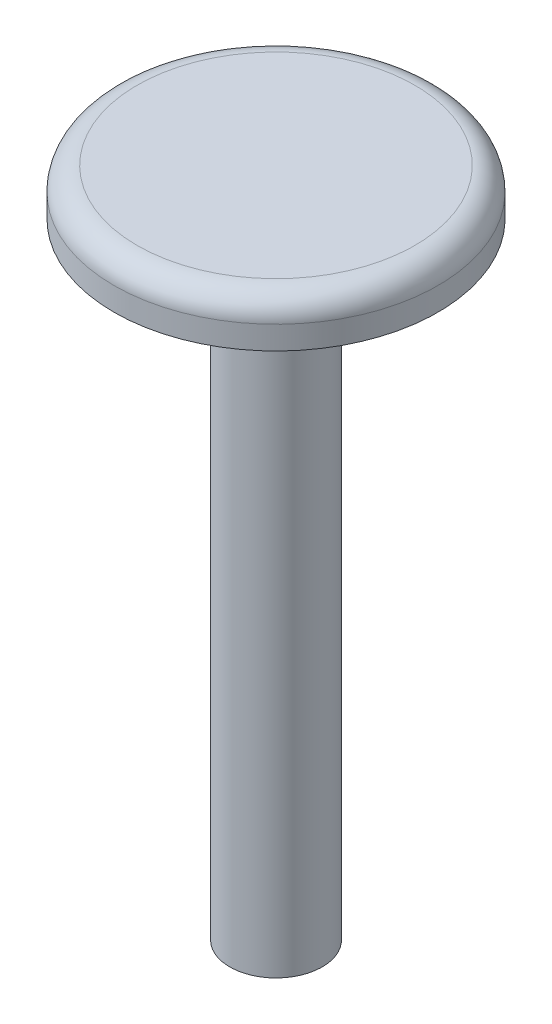
ISO-10303-21;
HEADER;
FILE_DESCRIPTION(('STEP AP214'),'2;1');
FILE_NAME('part.step','',(''),(''),'','','');
FILE_SCHEMA(('AUTOMOTIVE_DESIGN { 1 0 10303 214 1 1 1 1 }'));
ENDSEC;
DATA;
#1=APPLICATION_CONTEXT('core data for automotive mechanical design processes');
#2=APPLICATION_PROTOCOL_DEFINITION('international standard','automotive_design',2000,#1);
#3=PRODUCT_CONTEXT('',#1,'mechanical');
#4=PRODUCT('Part','Part','',(#3));
#5=PRODUCT_RELATED_PRODUCT_CATEGORY('part','',(#4));
#6=PRODUCT_DEFINITION_FORMATION('','',#4);
#7=PRODUCT_DEFINITION_CONTEXT('part definition',#1,'design');
#8=PRODUCT_DEFINITION('design','',#6,#7);
#9=PRODUCT_DEFINITION_SHAPE('','',#8);
#10=(LENGTH_UNIT() NAMED_UNIT(*) SI_UNIT(.MILLI.,.METRE.));
#11=(NAMED_UNIT(*) PLANE_ANGLE_UNIT() SI_UNIT($,.RADIAN.));
#12=(NAMED_UNIT(*) SI_UNIT($,.STERADIAN.) SOLID_ANGLE_UNIT());
#13=UNCERTAINTY_MEASURE_WITH_UNIT(LENGTH_MEASURE(1.E-05),#10,'distance_accuracy_value','');
#14=(GEOMETRIC_REPRESENTATION_CONTEXT(3) GLOBAL_UNCERTAINTY_ASSIGNED_CONTEXT((#13)) GLOBAL_UNIT_ASSIGNED_CONTEXT((#10,
#11,#12)) REPRESENTATION_CONTEXT('',''));
#15=CARTESIAN_POINT('',(0.,0.,0.));
#16=DIRECTION('',(0.,0.,1.));
#17=DIRECTION('',(1.,0.,0.));
#18=AXIS2_PLACEMENT_3D('',#15,#16,#17);
#19=CARTESIAN_POINT('',(0.,10.,0.));
#20=DIRECTION('',(0.,-1.,0.));
#21=DIRECTION('',(0.,0.,-1.));
#22=AXIS2_PLACEMENT_3D('',#19,#20,#21);
#23=CYLINDRICAL_SURFACE('',#22,35.);
#24=CARTESIAN_POINT('',(0.,5.,0.));
#25=DIRECTION('',(0.,1.,0.));
#26=DIRECTION('',(0.,0.,1.));
#27=AXIS2_PLACEMENT_3D('',#24,#25,#26);
#28=CIRCLE('',#27,35.);
#29=CARTESIAN_POINT('',(0.,5.,35.));
#30=VERTEX_POINT('',#29);
#31=EDGE_CURVE('E10',#30,#30,#28,.F.);
#32=ORIENTED_EDGE('',*,*,#31,.T.);
#33=EDGE_LOOP('',(#32));
#34=FACE_BOUND('',#33,.T.);
#35=CARTESIAN_POINT('',(0.,0.,0.));
#36=DIRECTION('',(0.,1.,0.));
#37=DIRECTION('',(0.,0.,1.));
#38=AXIS2_PLACEMENT_3D('',#35,#36,#37);
#39=CIRCLE('',#38,35.);
#40=CARTESIAN_POINT('',(0.,0.,35.));
#41=VERTEX_POINT('',#40);
#42=EDGE_CURVE('E53',#41,#41,#39,.T.);
#43=ORIENTED_EDGE('',*,*,#42,.T.);
#44=EDGE_LOOP('',(#43));
#45=FACE_BOUND('',#44,.T.);
#46=ADVANCED_FACE('F39',(#34,#45),#23,.T.);
#47=CARTESIAN_POINT('',(0.,10.,0.));
#48=DIRECTION('',(0.,1.,0.));
#49=DIRECTION('',(0.,0.,1.));
#50=AXIS2_PLACEMENT_3D('',#47,#48,#49);
#51=PLANE('',#50);
#52=CARTESIAN_POINT('',(0.,10.,0.));
#53=DIRECTION('',(0.,1.,0.));
#54=DIRECTION('',(0.,0.,1.));
#55=AXIS2_PLACEMENT_3D('',#52,#53,#54);
#56=CIRCLE('',#55,30.);
#57=CARTESIAN_POINT('',(0.,10.,30.));
#58=VERTEX_POINT('',#57);
#59=EDGE_CURVE('E46',#58,#58,#56,.T.);
#60=ORIENTED_EDGE('',*,*,#59,.T.);
#61=EDGE_LOOP('',(#60));
#62=FACE_BOUND('',#61,.T.);
#63=ADVANCED_FACE('F74',(#62),#51,.T.);
#64=CARTESIAN_POINT('',(0.,0.,0.));
#65=DIRECTION('',(0.,1.,0.));
#66=DIRECTION('',(0.,0.,1.));
#67=AXIS2_PLACEMENT_3D('',#64,#65,#66);
#68=PLANE('',#67);
#69=CARTESIAN_POINT('',(0.,0.,0.));
#70=DIRECTION('',(0.,-1.,0.));
#71=DIRECTION('',(0.,0.,-1.));
#72=AXIS2_PLACEMENT_3D('',#69,#70,#71);
#73=CIRCLE('',#72,10.);
#74=CARTESIAN_POINT('',(0.,0.,-10.));
#75=VERTEX_POINT('',#74);
#76=EDGE_CURVE('E49',#75,#75,#73,.T.);
#77=ORIENTED_EDGE('',*,*,#76,.F.);
#78=EDGE_LOOP('',(#77));
#79=FACE_BOUND('',#78,.T.);
#80=ORIENTED_EDGE('',*,*,#42,.F.);
#81=EDGE_LOOP('',(#80));
#82=FACE_BOUND('',#81,.T.);
#83=ADVANCED_FACE('F68',(#79,#82),#68,.F.);
#84=CARTESIAN_POINT('',(0.,-135.,0.));
#85=DIRECTION('',(0.,1.,0.));
#86=DIRECTION('',(0.,0.,1.));
#87=AXIS2_PLACEMENT_3D('',#84,#85,#86);
#88=CYLINDRICAL_SURFACE('',#87,10.);
#89=CARTESIAN_POINT('',(0.,-135.,0.));
#90=DIRECTION('',(0.,-1.,0.));
#91=DIRECTION('',(0.,0.,-1.));
#92=AXIS2_PLACEMENT_3D('',#89,#90,#91);
#93=CIRCLE('',#92,10.);
#94=CARTESIAN_POINT('',(0.,-135.,-10.));
#95=VERTEX_POINT('',#94);
#96=EDGE_CURVE('E59',#95,#95,#93,.T.);
#97=ORIENTED_EDGE('',*,*,#96,.F.);
#98=EDGE_LOOP('',(#97));
#99=FACE_BOUND('',#98,.T.);
#100=ORIENTED_EDGE('',*,*,#76,.T.);
#101=EDGE_LOOP('',(#100));
#102=FACE_BOUND('',#101,.T.);
#103=ADVANCED_FACE('F64',(#99,#102),#88,.T.);
#104=CARTESIAN_POINT('',(0.,-135.,0.));
#105=DIRECTION('',(0.,-1.,0.));
#106=DIRECTION('',(0.,0.,-1.));
#107=AXIS2_PLACEMENT_3D('',#104,#105,#106);
#108=PLANE('',#107);
#109=ORIENTED_EDGE('',*,*,#96,.T.);
#110=EDGE_LOOP('',(#109));
#111=FACE_BOUND('',#110,.T.);
#112=ADVANCED_FACE('F62',(#111),#108,.T.);
#113=CARTESIAN_POINT('',(0.,5.,0.));
#114=DIRECTION('',(0.,1.,0.));
#115=DIRECTION('',(0.,0.,1.));
#116=AXIS2_PLACEMENT_3D('',#113,#114,#115);
#117=TOROIDAL_SURFACE('',#116,30.,5.);
#118=ORIENTED_EDGE('',*,*,#31,.F.);
#119=EDGE_LOOP('',(#118));
#120=FACE_BOUND('',#119,.T.);
#121=ORIENTED_EDGE('',*,*,#59,.F.);
#122=EDGE_LOOP('',(#121));
#123=FACE_BOUND('',#122,.T.);
#124=ADVANCED_FACE('F41',(#120,#123),#117,.T.);
#125=CLOSED_SHELL('',(#46,#63,#83,#103,#112,#124));
#126=MANIFOLD_SOLID_BREP('B2',#125);
#127=ADVANCED_BREP_SHAPE_REPRESENTATION('',(#18,#126),#14);
#128=SHAPE_DEFINITION_REPRESENTATION(#9,#127);
ENDSEC;
END-ISO-10303-21;
